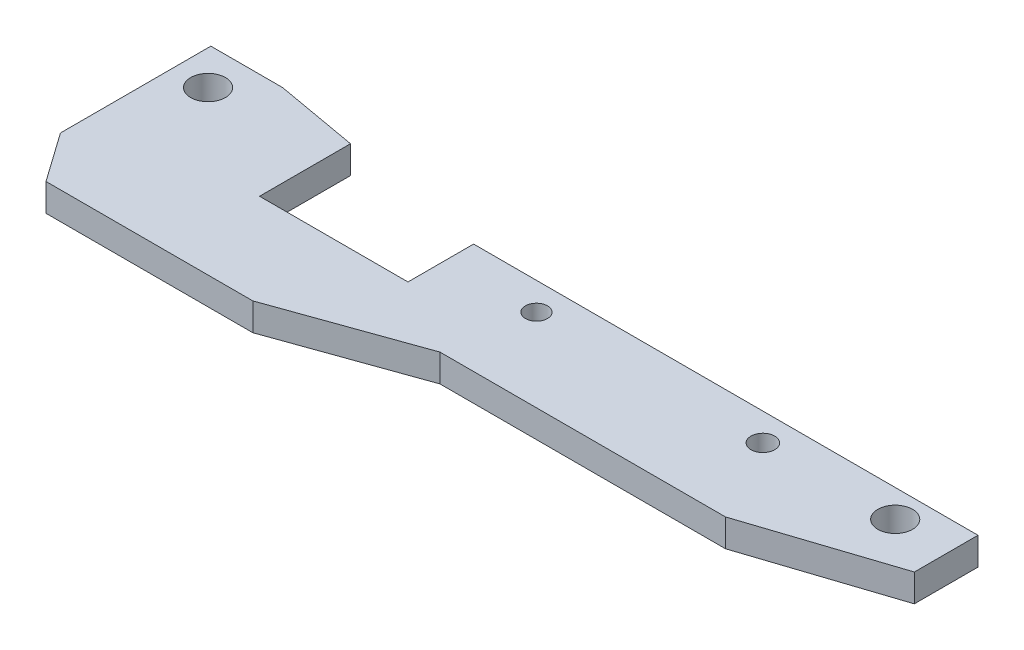
ISO-10303-21;
HEADER;
FILE_DESCRIPTION(('STEP AP214'),'2;1');
FILE_NAME('part.step','',(''),(''),'','','');
FILE_SCHEMA(('AUTOMOTIVE_DESIGN { 1 0 10303 214 1 1 1 1 }'));
ENDSEC;
DATA;
#1=APPLICATION_CONTEXT('core data for automotive mechanical design processes');
#2=APPLICATION_PROTOCOL_DEFINITION('international standard','automotive_design',2000,#1);
#3=PRODUCT_CONTEXT('',#1,'mechanical');
#4=PRODUCT('Part','Part','',(#3));
#5=PRODUCT_RELATED_PRODUCT_CATEGORY('part','',(#4));
#6=PRODUCT_DEFINITION_FORMATION('','',#4);
#7=PRODUCT_DEFINITION_CONTEXT('part definition',#1,'design');
#8=PRODUCT_DEFINITION('design','',#6,#7);
#9=PRODUCT_DEFINITION_SHAPE('','',#8);
#10=(LENGTH_UNIT() NAMED_UNIT(*) SI_UNIT(.MILLI.,.METRE.));
#11=(NAMED_UNIT(*) PLANE_ANGLE_UNIT() SI_UNIT($,.RADIAN.));
#12=(NAMED_UNIT(*) SI_UNIT($,.STERADIAN.) SOLID_ANGLE_UNIT());
#13=UNCERTAINTY_MEASURE_WITH_UNIT(LENGTH_MEASURE(1.E-05),#10,'distance_accuracy_value','');
#14=(GEOMETRIC_REPRESENTATION_CONTEXT(3) GLOBAL_UNCERTAINTY_ASSIGNED_CONTEXT((#13)) GLOBAL_UNIT_ASSIGNED_CONTEXT((#10,
#11,#12)) REPRESENTATION_CONTEXT('',''));
#15=CARTESIAN_POINT('',(0.,0.,0.));
#16=DIRECTION('',(0.,0.,1.));
#17=DIRECTION('',(1.,0.,0.));
#18=AXIS2_PLACEMENT_3D('',#15,#16,#17);
#19=CARTESIAN_POINT('',(0.,2.54,0.));
#20=DIRECTION('',(0.,-1.,0.));
#21=DIRECTION('',(0.,0.,-1.));
#22=AXIS2_PLACEMENT_3D('',#19,#20,#21);
#23=PLANE('',#22);
#24=DIRECTION('',(-1.,0.,0.));
#25=VECTOR('',#24,1.);
#26=CARTESIAN_POINT('',(37.0461769890101,2.54,-5.06924480835134));
#27=LINE('',#26,#25);
#28=CARTESIAN_POINT('',(60.5411769890101,2.54,-5.06924480835134));
#29=VERTEX_POINT('',#28);
#30=CARTESIAN_POINT('',(14.1152848774863,2.54,-5.06924480835134));
#31=VERTEX_POINT('',#30);
#32=EDGE_CURVE('E129',#29,#31,#27,.T.);
#33=ORIENTED_EDGE('',*,*,#32,.T.);
#34=DIRECTION('',(0.,0.,1.));
#35=VECTOR('',#34,1.);
#36=CARTESIAN_POINT('',(14.1152848774863,2.54,0.973058981245771));
#37=LINE('',#36,#35);
#38=CARTESIAN_POINT('',(14.1152848774863,2.54,0.973058981245771));
#39=VERTEX_POINT('',#38);
#40=EDGE_CURVE('E222',#31,#39,#37,.T.);
#41=ORIENTED_EDGE('',*,*,#40,.T.);
#42=DIRECTION('',(-1.,0.,0.));
#43=VECTOR('',#42,1.);
#44=CARTESIAN_POINT('',(14.1152848774863,2.54,0.973058981245771));
#45=LINE('',#44,#43);
#46=CARTESIAN_POINT('',(0.453182196665078,2.54,0.973058981245771));
#47=VERTEX_POINT('',#46);
#48=EDGE_CURVE('E216',#39,#47,#45,.T.);
#49=ORIENTED_EDGE('',*,*,#48,.T.);
#50=DIRECTION('',(0.,0.,-1.));
#51=VECTOR('',#50,1.);
#52=CARTESIAN_POINT('',(0.453182196665078,2.54,0.973058981245771));
#53=LINE('',#52,#51);
#54=CARTESIAN_POINT('',(0.45318219666508,2.54,-7.40059943810157));
#55=VERTEX_POINT('',#54);
#56=EDGE_CURVE('E213',#47,#55,#53,.T.);
#57=ORIENTED_EDGE('',*,*,#56,.T.);
#58=DIRECTION('',(-0.984562507785906,0.,-0.175033334717495));
#59=VECTOR('',#58,1.);
#60=CARTESIAN_POINT('',(-7.14982301098986,2.54,-8.75224480835134));
#61=LINE('',#60,#59);
#62=CARTESIAN_POINT('',(-7.14982301098986,2.54,-8.75224480835134));
#63=VERTEX_POINT('',#62);
#64=EDGE_CURVE('E148',#55,#63,#61,.T.);
#65=ORIENTED_EDGE('',*,*,#64,.T.);
#66=DIRECTION('',(-1.,0.,0.));
#67=VECTOR('',#66,1.);
#68=CARTESIAN_POINT('',(-13.7538230109899,2.54,-8.75224480835134));
#69=LINE('',#68,#67);
#70=CARTESIAN_POINT('',(-13.7538230109899,2.54,-8.75224480835134));
#71=VERTEX_POINT('',#70);
#72=EDGE_CURVE('E150',#63,#71,#69,.T.);
#73=ORIENTED_EDGE('',*,*,#72,.T.);
#74=DIRECTION('',(0.,0.,1.));
#75=VECTOR('',#74,1.);
#76=CARTESIAN_POINT('',(-13.7538230109899,2.54,-2.78324480835134));
#77=LINE('',#76,#75);
#78=CARTESIAN_POINT('',(-13.7538230109899,2.54,5.09075519164866));
#79=VERTEX_POINT('',#78);
#80=EDGE_CURVE('E57',#71,#79,#77,.T.);
#81=ORIENTED_EDGE('',*,*,#80,.T.);
#82=DIRECTION('',(0.57707387330152,0.,0.816691952178287));
#83=VECTOR('',#82,1.);
#84=CARTESIAN_POINT('',(-10.5512872241797,2.54,9.62307821761971));
#85=LINE('',#84,#83);
#86=CARTESIAN_POINT('',(-10.5512872241797,2.54,9.62307821761971));
#87=VERTEX_POINT('',#86);
#88=EDGE_CURVE('E103',#79,#87,#85,.T.);
#89=ORIENTED_EDGE('',*,*,#88,.T.);
#90=DIRECTION('',(1.,0.,0.));
#91=VECTOR('',#90,1.);
#92=CARTESIAN_POINT('',(8.47904740989478,2.54,9.62307821761971));
#93=LINE('',#92,#91);
#94=CARTESIAN_POINT('',(8.47904740989478,2.54,9.62307821761971));
#95=VERTEX_POINT('',#94);
#96=EDGE_CURVE('E259',#87,#95,#93,.T.);
#97=ORIENTED_EDGE('',*,*,#96,.T.);
#98=DIRECTION('',(0.941800205077323,0.,-0.33617313056863));
#99=VECTOR('',#98,1.);
#100=CARTESIAN_POINT('',(21.1765010942986,2.54,5.09075519164867));
#101=LINE('',#100,#99);
#102=CARTESIAN_POINT('',(21.1765010942986,2.54,5.09075519164867));
#103=VERTEX_POINT('',#102);
#104=EDGE_CURVE('E261',#95,#103,#101,.T.);
#105=ORIENTED_EDGE('',*,*,#104,.T.);
#106=DIRECTION('',(1.,0.,0.));
#107=VECTOR('',#106,1.);
#108=CARTESIAN_POINT('',(33.8765010942986,2.54,5.09075519164866));
#109=LINE('',#108,#107);
#110=CARTESIAN_POINT('',(47.4554541327127,2.54,5.09075519164866));
#111=VERTEX_POINT('',#110);
#112=EDGE_CURVE('E263',#103,#111,#109,.T.);
#113=ORIENTED_EDGE('',*,*,#112,.T.);
#114=DIRECTION('',(0.949998426005129,0.,-0.312254688656197));
#115=VECTOR('',#114,1.);
#116=CARTESIAN_POINT('',(60.5411769890101,2.54,0.789612995532677));
#117=LINE('',#116,#115);
#118=CARTESIAN_POINT('',(60.5411769890101,2.54,0.789612995532677));
#119=VERTEX_POINT('',#118);
#120=EDGE_CURVE('E131',#111,#119,#117,.T.);
#121=ORIENTED_EDGE('',*,*,#120,.T.);
#122=DIRECTION('',(0.,0.,-1.));
#123=VECTOR('',#122,1.);
#124=CARTESIAN_POINT('',(60.5411769890101,2.54,0.0107551916486591));
#125=LINE('',#124,#123);
#126=EDGE_CURVE('E123',#119,#29,#125,.T.);
#127=ORIENTED_EDGE('',*,*,#126,.T.);
#128=EDGE_LOOP('',(#33,#41,#49,#57,#65,#73,#81,#89,#97,#105,#113,#121,#127));
#129=FACE_BOUND('',#128,.T.);
#130=CARTESIAN_POINT('',(55.4611769890101,2.54,-2.52924480835134));
#131=DIRECTION('',(0.,1.,0.));
#132=DIRECTION('',(0.,0.,1.));
#133=AXIS2_PLACEMENT_3D('',#130,#131,#132);
#134=CIRCLE('',#133,1.600000102);
#135=CARTESIAN_POINT('',(55.4611769890101,2.54,-0.929244706351344));
#136=VERTEX_POINT('',#135);
#137=EDGE_CURVE('E241',#136,#136,#134,.T.);
#138=ORIENTED_EDGE('',*,*,#137,.F.);
#139=EDGE_LOOP('',(#138));
#140=FACE_BOUND('',#139,.T.);
#141=CARTESIAN_POINT('',(-10.5788230109899,2.54,-5.32324480835134));
#142=DIRECTION('',(0.,1.,0.));
#143=DIRECTION('',(0.,0.,1.));
#144=AXIS2_PLACEMENT_3D('',#141,#142,#143);
#145=CIRCLE('',#144,1.600000102);
#146=CARTESIAN_POINT('',(-10.5788230109899,2.54,-3.72324470635134));
#147=VERTEX_POINT('',#146);
#148=EDGE_CURVE('E159',#147,#147,#145,.T.);
#149=ORIENTED_EDGE('',*,*,#148,.F.);
#150=EDGE_LOOP('',(#149));
#151=FACE_BOUND('',#150,.T.);
#152=CARTESIAN_POINT('',(22.4411769890101,2.54,-2.52924480835134));
#153=DIRECTION('',(0.,1.,0.));
#154=DIRECTION('',(0.,0.,1.));
#155=AXIS2_PLACEMENT_3D('',#152,#153,#154);
#156=CIRCLE('',#155,1.016);
#157=CARTESIAN_POINT('',(22.4411769890101,2.54,-1.51324480835134));
#158=VERTEX_POINT('',#157);
#159=EDGE_CURVE('E247',#158,#158,#156,.T.);
#160=ORIENTED_EDGE('',*,*,#159,.F.);
#161=EDGE_LOOP('',(#160));
#162=FACE_BOUND('',#161,.T.);
#163=CARTESIAN_POINT('',(43.2781072075675,2.54,-2.52924480835134));
#164=DIRECTION('',(0.,1.,0.));
#165=DIRECTION('',(0.,0.,1.));
#166=AXIS2_PLACEMENT_3D('',#163,#164,#165);
#167=CIRCLE('',#166,1.0922);
#168=CARTESIAN_POINT('',(43.2781072075675,2.54,-1.43704480835134));
#169=VERTEX_POINT('',#168);
#170=EDGE_CURVE('E235',#169,#169,#167,.T.);
#171=ORIENTED_EDGE('',*,*,#170,.F.);
#172=EDGE_LOOP('',(#171));
#173=FACE_BOUND('',#172,.T.);
#174=ADVANCED_FACE('F33',(#129,#140,#151,#162,#173),#23,.F.);
#175=CARTESIAN_POINT('',(0.,0.,0.));
#176=DIRECTION('',(0.,-1.,0.));
#177=DIRECTION('',(0.,0.,-1.));
#178=AXIS2_PLACEMENT_3D('',#175,#176,#177);
#179=PLANE('',#178);
#180=DIRECTION('',(0.,0.,1.));
#181=VECTOR('',#180,1.);
#182=CARTESIAN_POINT('',(14.1152848774863,0.,0.973058981245771));
#183=LINE('',#182,#181);
#184=CARTESIAN_POINT('',(14.1152848774863,0.,-5.06924480835134));
#185=VERTEX_POINT('',#184);
#186=CARTESIAN_POINT('',(14.1152848774863,0.,0.973058981245771));
#187=VERTEX_POINT('',#186);
#188=EDGE_CURVE('E226',#185,#187,#183,.T.);
#189=ORIENTED_EDGE('',*,*,#188,.F.);
#190=DIRECTION('',(-1.,0.,0.));
#191=VECTOR('',#190,1.);
#192=CARTESIAN_POINT('',(13.5670519890101,0.,-5.06924480835134));
#193=LINE('',#192,#191);
#194=CARTESIAN_POINT('',(60.5411769890101,0.,-5.06924480835134));
#195=VERTEX_POINT('',#194);
#196=EDGE_CURVE('E170',#195,#185,#193,.T.);
#197=ORIENTED_EDGE('',*,*,#196,.F.);
#198=DIRECTION('',(0.,0.,-1.));
#199=VECTOR('',#198,1.);
#200=CARTESIAN_POINT('',(60.5411769890101,0.,-5.06924480835134));
#201=LINE('',#200,#199);
#202=CARTESIAN_POINT('',(60.5411769890101,0.,0.789612995532677));
#203=VERTEX_POINT('',#202);
#204=EDGE_CURVE('E140',#203,#195,#201,.T.);
#205=ORIENTED_EDGE('',*,*,#204,.F.);
#206=DIRECTION('',(0.949998426005129,0.,-0.312254688656197));
#207=VECTOR('',#206,1.);
#208=CARTESIAN_POINT('',(60.5411769890101,0.,0.789612995532677));
#209=LINE('',#208,#207);
#210=CARTESIAN_POINT('',(47.4554541327127,0.,5.09075519164866));
#211=VERTEX_POINT('',#210);
#212=EDGE_CURVE('E166',#211,#203,#209,.T.);
#213=ORIENTED_EDGE('',*,*,#212,.F.);
#214=DIRECTION('',(1.,0.,0.));
#215=VECTOR('',#214,1.);
#216=CARTESIAN_POINT('',(47.4554541327127,0.,5.09075519164866));
#217=LINE('',#216,#215);
#218=CARTESIAN_POINT('',(21.1765010942986,0.,5.09075519164867));
#219=VERTEX_POINT('',#218);
#220=EDGE_CURVE('E164',#219,#211,#217,.T.);
#221=ORIENTED_EDGE('',*,*,#220,.F.);
#222=DIRECTION('',(0.941800205077323,0.,-0.33617313056863));
#223=VECTOR('',#222,1.);
#224=CARTESIAN_POINT('',(21.1765010942986,0.,5.09075519164867));
#225=LINE('',#224,#223);
#226=CARTESIAN_POINT('',(8.47904740989478,0.,9.62307821761971));
#227=VERTEX_POINT('',#226);
#228=EDGE_CURVE('E161',#227,#219,#225,.T.);
#229=ORIENTED_EDGE('',*,*,#228,.F.);
#230=DIRECTION('',(1.,0.,0.));
#231=VECTOR('',#230,1.);
#232=CARTESIAN_POINT('',(8.47904740989478,0.,9.62307821761971));
#233=LINE('',#232,#231);
#234=CARTESIAN_POINT('',(-10.5512872241797,0.,9.62307821761971));
#235=VERTEX_POINT('',#234);
#236=EDGE_CURVE('E158',#235,#227,#233,.T.);
#237=ORIENTED_EDGE('',*,*,#236,.F.);
#238=DIRECTION('',(0.57707387330152,0.,0.816691952178287));
#239=VECTOR('',#238,1.);
#240=CARTESIAN_POINT('',(-10.5512872241797,0.,9.62307821761971));
#241=LINE('',#240,#239);
#242=CARTESIAN_POINT('',(-13.7538230109899,0.,5.09075519164866));
#243=VERTEX_POINT('',#242);
#244=EDGE_CURVE('E156',#243,#235,#241,.T.);
#245=ORIENTED_EDGE('',*,*,#244,.F.);
#246=DIRECTION('',(0.,0.,1.));
#247=VECTOR('',#246,1.);
#248=CARTESIAN_POINT('',(-13.7538230109899,0.,-8.75224480835134));
#249=LINE('',#248,#247);
#250=CARTESIAN_POINT('',(-13.7538230109899,0.,-8.75224480835134));
#251=VERTEX_POINT('',#250);
#252=EDGE_CURVE('E175',#251,#243,#249,.T.);
#253=ORIENTED_EDGE('',*,*,#252,.F.);
#254=DIRECTION('',(-1.,0.,0.));
#255=VECTOR('',#254,1.);
#256=CARTESIAN_POINT('',(-13.7538230109899,0.,-8.75224480835134));
#257=LINE('',#256,#255);
#258=CARTESIAN_POINT('',(-7.14982301098986,0.,-8.75224480835134));
#259=VERTEX_POINT('',#258);
#260=EDGE_CURVE('E95',#259,#251,#257,.T.);
#261=ORIENTED_EDGE('',*,*,#260,.F.);
#262=DIRECTION('',(-0.984562507785906,0.,-0.175033334717495));
#263=VECTOR('',#262,1.);
#264=CARTESIAN_POINT('',(-7.14982301098986,0.,-8.75224480835134));
#265=LINE('',#264,#263);
#266=CARTESIAN_POINT('',(0.453182196665076,0.,-7.40059943810157));
#267=VERTEX_POINT('',#266);
#268=EDGE_CURVE('E172',#267,#259,#265,.T.);
#269=ORIENTED_EDGE('',*,*,#268,.F.);
#270=DIRECTION('',(0.,0.,-1.));
#271=VECTOR('',#270,1.);
#272=CARTESIAN_POINT('',(0.453182196665078,0.,0.973058981245771));
#273=LINE('',#272,#271);
#274=CARTESIAN_POINT('',(0.453182196665078,0.,0.973058981245771));
#275=VERTEX_POINT('',#274);
#276=EDGE_CURVE('E48',#275,#267,#273,.T.);
#277=ORIENTED_EDGE('',*,*,#276,.F.);
#278=DIRECTION('',(-1.,0.,0.));
#279=VECTOR('',#278,1.);
#280=CARTESIAN_POINT('',(14.1152848774863,0.,0.973058981245771));
#281=LINE('',#280,#279);
#282=EDGE_CURVE('E229',#187,#275,#281,.T.);
#283=ORIENTED_EDGE('',*,*,#282,.F.);
#284=EDGE_LOOP('',(#189,#197,#205,#213,#221,#229,#237,#245,#253,#261,#269,#277,#283));
#285=FACE_BOUND('',#284,.T.);
#286=CARTESIAN_POINT('',(55.4611769890101,0.,-2.52924480835134));
#287=DIRECTION('',(0.,1.,0.));
#288=DIRECTION('',(0.,0.,1.));
#289=AXIS2_PLACEMENT_3D('',#286,#287,#288);
#290=CIRCLE('',#289,1.600000102);
#291=CARTESIAN_POINT('',(55.4611769890101,0.,-0.929244706351344));
#292=VERTEX_POINT('',#291);
#293=EDGE_CURVE('E238',#292,#292,#290,.T.);
#294=ORIENTED_EDGE('',*,*,#293,.T.);
#295=EDGE_LOOP('',(#294));
#296=FACE_BOUND('',#295,.T.);
#297=CARTESIAN_POINT('',(-10.5788230109899,0.,-5.32324480835134));
#298=DIRECTION('',(0.,1.,0.));
#299=DIRECTION('',(0.,0.,1.));
#300=AXIS2_PLACEMENT_3D('',#297,#298,#299);
#301=CIRCLE('',#300,1.600000102);
#302=CARTESIAN_POINT('',(-10.5788230109899,0.,-3.72324470635134));
#303=VERTEX_POINT('',#302);
#304=EDGE_CURVE('E250',#303,#303,#301,.T.);
#305=ORIENTED_EDGE('',*,*,#304,.T.);
#306=EDGE_LOOP('',(#305));
#307=FACE_BOUND('',#306,.T.);
#308=CARTESIAN_POINT('',(22.4411769890101,0.,-2.52924480835134));
#309=DIRECTION('',(0.,1.,0.));
#310=DIRECTION('',(0.,0.,1.));
#311=AXIS2_PLACEMENT_3D('',#308,#309,#310);
#312=CIRCLE('',#311,1.016);
#313=CARTESIAN_POINT('',(22.4411769890101,0.,-1.51324480835134));
#314=VERTEX_POINT('',#313);
#315=EDGE_CURVE('E244',#314,#314,#312,.T.);
#316=ORIENTED_EDGE('',*,*,#315,.T.);
#317=EDGE_LOOP('',(#316));
#318=FACE_BOUND('',#317,.T.);
#319=CARTESIAN_POINT('',(43.2781072075675,0.,-2.52924480835134));
#320=DIRECTION('',(0.,1.,0.));
#321=DIRECTION('',(0.,0.,1.));
#322=AXIS2_PLACEMENT_3D('',#319,#320,#321);
#323=CIRCLE('',#322,1.0922);
#324=CARTESIAN_POINT('',(43.2781072075675,0.,-1.43704480835134));
#325=VERTEX_POINT('',#324);
#326=EDGE_CURVE('E233',#325,#325,#323,.T.);
#327=ORIENTED_EDGE('',*,*,#326,.T.);
#328=EDGE_LOOP('',(#327));
#329=FACE_BOUND('',#328,.T.);
#330=ADVANCED_FACE('F202',(#285,#296,#307,#318,#329),#179,.T.);
#331=CARTESIAN_POINT('',(-10.5512872241797,2.54,9.62307821761971));
#332=DIRECTION('',(0.816691952178287,0.,-0.57707387330152));
#333=DIRECTION('',(-0.57707387330152,0.,-0.816691952178287));
#334=AXIS2_PLACEMENT_3D('',#331,#332,#333);
#335=PLANE('',#334);
#336=ORIENTED_EDGE('',*,*,#244,.T.);
#337=DIRECTION('',(0.,-1.,0.));
#338=VECTOR('',#337,1.);
#339=CARTESIAN_POINT('',(-10.5512872241797,2.54,9.62307821761971));
#340=LINE('',#339,#338);
#341=EDGE_CURVE('E189',#87,#235,#340,.T.);
#342=ORIENTED_EDGE('',*,*,#341,.F.);
#343=ORIENTED_EDGE('',*,*,#88,.F.);
#344=DIRECTION('',(0.,-1.,0.));
#345=VECTOR('',#344,1.);
#346=CARTESIAN_POINT('',(-13.7538230109899,2.54,5.09075519164866));
#347=LINE('',#346,#345);
#348=EDGE_CURVE('E192',#79,#243,#347,.T.);
#349=ORIENTED_EDGE('',*,*,#348,.T.);
#350=EDGE_LOOP('',(#336,#342,#343,#349));
#351=FACE_BOUND('',#350,.T.);
#352=ADVANCED_FACE('F35',(#351),#335,.F.);
#353=CARTESIAN_POINT('',(8.47904740989478,2.54,9.62307821761971));
#354=DIRECTION('',(0.,0.,-1.));
#355=DIRECTION('',(-1.,0.,0.));
#356=AXIS2_PLACEMENT_3D('',#353,#354,#355);
#357=PLANE('',#356);
#358=ORIENTED_EDGE('',*,*,#236,.T.);
#359=DIRECTION('',(0.,-1.,0.));
#360=VECTOR('',#359,1.);
#361=CARTESIAN_POINT('',(8.47904740989478,2.54,9.62307821761971));
#362=LINE('',#361,#360);
#363=EDGE_CURVE('E186',#95,#227,#362,.T.);
#364=ORIENTED_EDGE('',*,*,#363,.F.);
#365=ORIENTED_EDGE('',*,*,#96,.F.);
#366=ORIENTED_EDGE('',*,*,#341,.T.);
#367=EDGE_LOOP('',(#358,#364,#365,#366));
#368=FACE_BOUND('',#367,.T.);
#369=ADVANCED_FACE('F325',(#368),#357,.F.);
#370=CARTESIAN_POINT('',(21.1765010942986,2.54,5.09075519164867));
#371=DIRECTION('',(-0.33617313056863,0.,-0.941800205077323));
#372=DIRECTION('',(-0.941800205077323,0.,0.33617313056863));
#373=AXIS2_PLACEMENT_3D('',#370,#371,#372);
#374=PLANE('',#373);
#375=ORIENTED_EDGE('',*,*,#228,.T.);
#376=DIRECTION('',(0.,-1.,0.));
#377=VECTOR('',#376,1.);
#378=CARTESIAN_POINT('',(21.1765010942986,2.54,5.09075519164867));
#379=LINE('',#378,#377);
#380=EDGE_CURVE('E183',#103,#219,#379,.T.);
#381=ORIENTED_EDGE('',*,*,#380,.F.);
#382=ORIENTED_EDGE('',*,*,#104,.F.);
#383=ORIENTED_EDGE('',*,*,#363,.T.);
#384=EDGE_LOOP('',(#375,#381,#382,#383));
#385=FACE_BOUND('',#384,.T.);
#386=ADVANCED_FACE('F323',(#385),#374,.F.);
#387=CARTESIAN_POINT('',(47.4554541327127,2.54,5.09075519164866));
#388=DIRECTION('',(0.,0.,-1.));
#389=DIRECTION('',(-1.,0.,0.));
#390=AXIS2_PLACEMENT_3D('',#387,#388,#389);
#391=PLANE('',#390);
#392=ORIENTED_EDGE('',*,*,#220,.T.);
#393=DIRECTION('',(0.,-1.,0.));
#394=VECTOR('',#393,1.);
#395=CARTESIAN_POINT('',(47.4554541327127,2.54,5.09075519164866));
#396=LINE('',#395,#394);
#397=EDGE_CURVE('E180',#111,#211,#396,.T.);
#398=ORIENTED_EDGE('',*,*,#397,.F.);
#399=ORIENTED_EDGE('',*,*,#112,.F.);
#400=ORIENTED_EDGE('',*,*,#380,.T.);
#401=EDGE_LOOP('',(#392,#398,#399,#400));
#402=FACE_BOUND('',#401,.T.);
#403=ADVANCED_FACE('F269',(#402),#391,.F.);
#404=CARTESIAN_POINT('',(60.5411769890101,2.54,0.789612995532677));
#405=DIRECTION('',(-0.312254688656197,0.,-0.949998426005128));
#406=DIRECTION('',(-0.949998426005129,0.,0.312254688656197));
#407=AXIS2_PLACEMENT_3D('',#404,#405,#406);
#408=PLANE('',#407);
#409=ORIENTED_EDGE('',*,*,#212,.T.);
#410=DIRECTION('',(0.,-1.,0.));
#411=VECTOR('',#410,1.);
#412=CARTESIAN_POINT('',(60.5411769890101,2.54,0.789612995532677));
#413=LINE('',#412,#411);
#414=EDGE_CURVE('E143',#119,#203,#413,.T.);
#415=ORIENTED_EDGE('',*,*,#414,.F.);
#416=ORIENTED_EDGE('',*,*,#120,.F.);
#417=ORIENTED_EDGE('',*,*,#397,.T.);
#418=EDGE_LOOP('',(#409,#415,#416,#417));
#419=FACE_BOUND('',#418,.T.);
#420=ADVANCED_FACE('F272',(#419),#408,.F.);
#421=CARTESIAN_POINT('',(60.5411769890101,2.54,-5.06924480835134));
#422=DIRECTION('',(-1.,0.,0.));
#423=DIRECTION('',(0.,0.,1.));
#424=AXIS2_PLACEMENT_3D('',#421,#422,#423);
#425=PLANE('',#424);
#426=ORIENTED_EDGE('',*,*,#204,.T.);
#427=DIRECTION('',(0.,-1.,0.));
#428=VECTOR('',#427,1.);
#429=CARTESIAN_POINT('',(60.5411769890101,2.54,-5.06924480835134));
#430=LINE('',#429,#428);
#431=EDGE_CURVE('E138',#29,#195,#430,.T.);
#432=ORIENTED_EDGE('',*,*,#431,.F.);
#433=ORIENTED_EDGE('',*,*,#126,.F.);
#434=ORIENTED_EDGE('',*,*,#414,.T.);
#435=EDGE_LOOP('',(#426,#432,#433,#434));
#436=FACE_BOUND('',#435,.T.);
#437=ADVANCED_FACE('F139',(#436),#425,.F.);
#438=CARTESIAN_POINT('',(13.5670519890101,2.54,-5.06924480835134));
#439=DIRECTION('',(0.,0.,1.));
#440=DIRECTION('',(1.,0.,0.));
#441=AXIS2_PLACEMENT_3D('',#438,#439,#440);
#442=PLANE('',#441);
#443=ORIENTED_EDGE('',*,*,#196,.T.);
#444=DIRECTION('',(0.,1.,0.));
#445=VECTOR('',#444,1.);
#446=CARTESIAN_POINT('',(14.1152848774863,2.54,-5.06924480835134));
#447=LINE('',#446,#445);
#448=EDGE_CURVE('E11',#185,#31,#447,.T.);
#449=ORIENTED_EDGE('',*,*,#448,.T.);
#450=ORIENTED_EDGE('',*,*,#32,.F.);
#451=ORIENTED_EDGE('',*,*,#431,.T.);
#452=EDGE_LOOP('',(#443,#449,#450,#451));
#453=FACE_BOUND('',#452,.T.);
#454=ADVANCED_FACE('F146',(#453),#442,.F.);
#455=CARTESIAN_POINT('',(-7.14982301098986,2.54,-8.75224480835134));
#456=DIRECTION('',(-0.175033334717495,0.,0.984562507785907));
#457=DIRECTION('',(0.984562507785907,0.,0.175033334717495));
#458=AXIS2_PLACEMENT_3D('',#455,#456,#457);
#459=PLANE('',#458);
#460=ORIENTED_EDGE('',*,*,#64,.F.);
#461=DIRECTION('',(0.,-1.,0.));
#462=VECTOR('',#461,1.);
#463=CARTESIAN_POINT('',(0.45318219666508,2.54,-7.40059943810157));
#464=LINE('',#463,#462);
#465=EDGE_CURVE('E41',#55,#267,#464,.T.);
#466=ORIENTED_EDGE('',*,*,#465,.T.);
#467=ORIENTED_EDGE('',*,*,#268,.T.);
#468=DIRECTION('',(0.,-1.,0.));
#469=VECTOR('',#468,1.);
#470=CARTESIAN_POINT('',(-7.14982301098986,2.54,-8.75224480835134));
#471=LINE('',#470,#469);
#472=EDGE_CURVE('E144',#63,#259,#471,.T.);
#473=ORIENTED_EDGE('',*,*,#472,.F.);
#474=EDGE_LOOP('',(#460,#466,#467,#473));
#475=FACE_BOUND('',#474,.T.);
#476=ADVANCED_FACE('F196',(#475),#459,.F.);
#477=CARTESIAN_POINT('',(-13.7538230109899,2.54,-8.75224480835134));
#478=DIRECTION('',(0.,0.,1.));
#479=DIRECTION('',(1.,0.,0.));
#480=AXIS2_PLACEMENT_3D('',#477,#478,#479);
#481=PLANE('',#480);
#482=ORIENTED_EDGE('',*,*,#260,.T.);
#483=DIRECTION('',(0.,-1.,0.));
#484=VECTOR('',#483,1.);
#485=CARTESIAN_POINT('',(-13.7538230109899,2.54,-8.75224480835134));
#486=LINE('',#485,#484);
#487=EDGE_CURVE('E155',#71,#251,#486,.T.);
#488=ORIENTED_EDGE('',*,*,#487,.F.);
#489=ORIENTED_EDGE('',*,*,#72,.F.);
#490=ORIENTED_EDGE('',*,*,#472,.T.);
#491=EDGE_LOOP('',(#482,#488,#489,#490));
#492=FACE_BOUND('',#491,.T.);
#493=ADVANCED_FACE('F211',(#492),#481,.F.);
#494=CARTESIAN_POINT('',(-13.7538230109899,2.54,-8.75224480835134));
#495=DIRECTION('',(1.,0.,0.));
#496=DIRECTION('',(0.,0.,-1.));
#497=AXIS2_PLACEMENT_3D('',#494,#495,#496);
#498=PLANE('',#497);
#499=ORIENTED_EDGE('',*,*,#252,.T.);
#500=ORIENTED_EDGE('',*,*,#348,.F.);
#501=ORIENTED_EDGE('',*,*,#80,.F.);
#502=ORIENTED_EDGE('',*,*,#487,.T.);
#503=EDGE_LOOP('',(#499,#500,#501,#502));
#504=FACE_BOUND('',#503,.T.);
#505=ADVANCED_FACE('F209',(#504),#498,.F.);
#506=CARTESIAN_POINT('',(-10.5788230109899,2.54,-5.32324480835134));
#507=DIRECTION('',(0.,-1.,0.));
#508=DIRECTION('',(0.,0.,-1.));
#509=AXIS2_PLACEMENT_3D('',#506,#507,#508);
#510=CYLINDRICAL_SURFACE('',#509,1.600000102);
#511=ORIENTED_EDGE('',*,*,#148,.T.);
#512=EDGE_LOOP('',(#511));
#513=FACE_BOUND('',#512,.T.);
#514=ORIENTED_EDGE('',*,*,#304,.F.);
#515=EDGE_LOOP('',(#514));
#516=FACE_BOUND('',#515,.T.);
#517=ADVANCED_FACE('F306',(#513,#516),#510,.F.);
#518=CARTESIAN_POINT('',(22.4411769890101,2.54,-2.52924480835134));
#519=DIRECTION('',(0.,-1.,0.));
#520=DIRECTION('',(0.,0.,-1.));
#521=AXIS2_PLACEMENT_3D('',#518,#519,#520);
#522=CYLINDRICAL_SURFACE('',#521,1.016);
#523=ORIENTED_EDGE('',*,*,#159,.T.);
#524=EDGE_LOOP('',(#523));
#525=FACE_BOUND('',#524,.T.);
#526=ORIENTED_EDGE('',*,*,#315,.F.);
#527=EDGE_LOOP('',(#526));
#528=FACE_BOUND('',#527,.T.);
#529=ADVANCED_FACE('F388',(#525,#528),#522,.F.);
#530=CARTESIAN_POINT('',(55.4611769890101,2.54,-2.52924480835134));
#531=DIRECTION('',(0.,-1.,0.));
#532=DIRECTION('',(0.,0.,-1.));
#533=AXIS2_PLACEMENT_3D('',#530,#531,#532);
#534=CYLINDRICAL_SURFACE('',#533,1.600000102);
#535=ORIENTED_EDGE('',*,*,#137,.T.);
#536=EDGE_LOOP('',(#535));
#537=FACE_BOUND('',#536,.T.);
#538=ORIENTED_EDGE('',*,*,#293,.F.);
#539=EDGE_LOOP('',(#538));
#540=FACE_BOUND('',#539,.T.);
#541=ADVANCED_FACE('F381',(#537,#540),#534,.F.);
#542=CARTESIAN_POINT('',(43.2781072075675,2.54,-2.52924480835134));
#543=DIRECTION('',(0.,-1.,0.));
#544=DIRECTION('',(0.,0.,-1.));
#545=AXIS2_PLACEMENT_3D('',#542,#543,#544);
#546=CYLINDRICAL_SURFACE('',#545,1.0922);
#547=ORIENTED_EDGE('',*,*,#170,.T.);
#548=EDGE_LOOP('',(#547));
#549=FACE_BOUND('',#548,.T.);
#550=ORIENTED_EDGE('',*,*,#326,.F.);
#551=EDGE_LOOP('',(#550));
#552=FACE_BOUND('',#551,.T.);
#553=ADVANCED_FACE('F297',(#549,#552),#546,.F.);
#554=CARTESIAN_POINT('',(14.1152848774863,2.54,0.973058981245771));
#555=DIRECTION('',(1.,0.,0.));
#556=DIRECTION('',(0.,0.,-1.));
#557=AXIS2_PLACEMENT_3D('',#554,#555,#556);
#558=PLANE('',#557);
#559=ORIENTED_EDGE('',*,*,#188,.T.);
#560=DIRECTION('',(0.,-1.,0.));
#561=VECTOR('',#560,1.);
#562=CARTESIAN_POINT('',(14.1152848774863,2.54,0.973058981245771));
#563=LINE('',#562,#561);
#564=EDGE_CURVE('E217',#39,#187,#563,.T.);
#565=ORIENTED_EDGE('',*,*,#564,.F.);
#566=ORIENTED_EDGE('',*,*,#40,.F.);
#567=ORIENTED_EDGE('',*,*,#448,.F.);
#568=EDGE_LOOP('',(#559,#565,#566,#567));
#569=FACE_BOUND('',#568,.T.);
#570=ADVANCED_FACE('F286',(#569),#558,.F.);
#571=CARTESIAN_POINT('',(0.453182196665078,2.54,0.973058981245771));
#572=DIRECTION('',(-1.,0.,0.));
#573=DIRECTION('',(0.,0.,1.));
#574=AXIS2_PLACEMENT_3D('',#571,#572,#573);
#575=PLANE('',#574);
#576=ORIENTED_EDGE('',*,*,#56,.F.);
#577=DIRECTION('',(0.,-1.,0.));
#578=VECTOR('',#577,1.);
#579=CARTESIAN_POINT('',(0.453182196665078,2.54,0.973058981245771));
#580=LINE('',#579,#578);
#581=EDGE_CURVE('E220',#47,#275,#580,.T.);
#582=ORIENTED_EDGE('',*,*,#581,.T.);
#583=ORIENTED_EDGE('',*,*,#276,.T.);
#584=ORIENTED_EDGE('',*,*,#465,.F.);
#585=EDGE_LOOP('',(#576,#582,#583,#584));
#586=FACE_BOUND('',#585,.T.);
#587=ADVANCED_FACE('F289',(#586),#575,.F.);
#588=CARTESIAN_POINT('',(14.1152848774863,2.54,0.973058981245771));
#589=DIRECTION('',(0.,0.,1.));
#590=DIRECTION('',(1.,0.,0.));
#591=AXIS2_PLACEMENT_3D('',#588,#589,#590);
#592=PLANE('',#591);
#593=ORIENTED_EDGE('',*,*,#282,.T.);
#594=ORIENTED_EDGE('',*,*,#581,.F.);
#595=ORIENTED_EDGE('',*,*,#48,.F.);
#596=ORIENTED_EDGE('',*,*,#564,.T.);
#597=EDGE_LOOP('',(#593,#594,#595,#596));
#598=FACE_BOUND('',#597,.T.);
#599=ADVANCED_FACE('F288',(#598),#592,.F.);
#600=CLOSED_SHELL('',(#174,#330,#352,#369,#386,#403,#420,#437,#454,#476,#493,#505,#517,#529,
#541,#553,#570,#587,#599));
#601=MANIFOLD_SOLID_BREP('B2',#600);
#602=ADVANCED_BREP_SHAPE_REPRESENTATION('',(#18,#601),#14);
#603=SHAPE_DEFINITION_REPRESENTATION(#9,#602);
ENDSEC;
END-ISO-10303-21;
